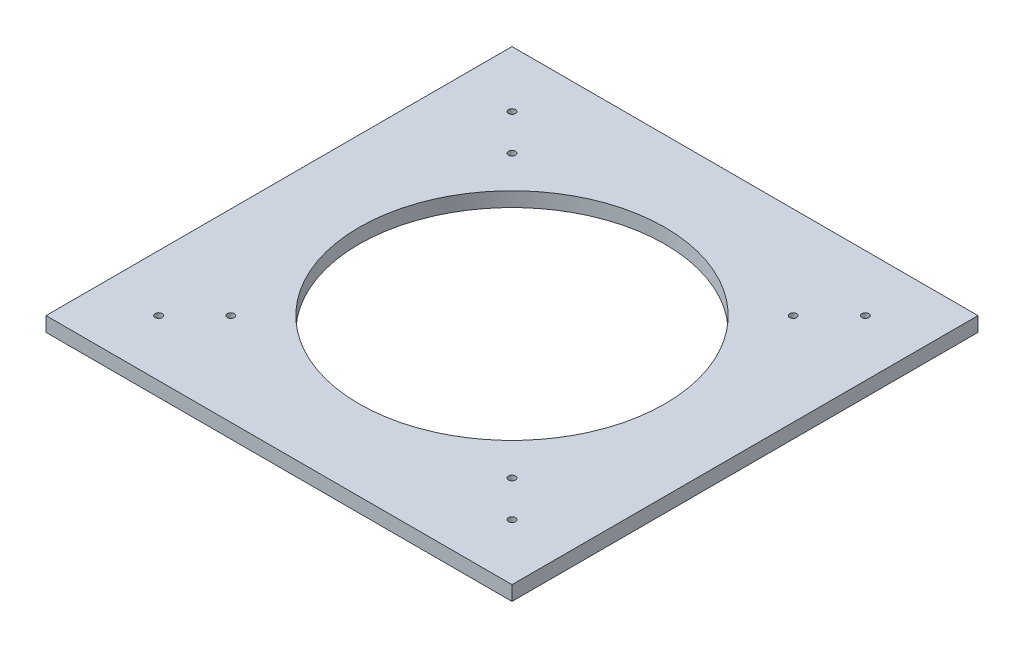
ISO-10303-21;
HEADER;
FILE_DESCRIPTION(('STEP AP214'),'2;1');
FILE_NAME('part.step','',(''),(''),'','','');
FILE_SCHEMA(('AUTOMOTIVE_DESIGN { 1 0 10303 214 1 1 1 1 }'));
ENDSEC;
DATA;
#1=APPLICATION_CONTEXT('core data for automotive mechanical design processes');
#2=APPLICATION_PROTOCOL_DEFINITION('international standard','automotive_design',2000,#1);
#3=PRODUCT_CONTEXT('',#1,'mechanical');
#4=PRODUCT('Part','Part','',(#3));
#5=PRODUCT_RELATED_PRODUCT_CATEGORY('part','',(#4));
#6=PRODUCT_DEFINITION_FORMATION('','',#4);
#7=PRODUCT_DEFINITION_CONTEXT('part definition',#1,'design');
#8=PRODUCT_DEFINITION('design','',#6,#7);
#9=PRODUCT_DEFINITION_SHAPE('','',#8);
#10=(LENGTH_UNIT() NAMED_UNIT(*) SI_UNIT(.MILLI.,.METRE.));
#11=(NAMED_UNIT(*) PLANE_ANGLE_UNIT() SI_UNIT($,.RADIAN.));
#12=(NAMED_UNIT(*) SI_UNIT($,.STERADIAN.) SOLID_ANGLE_UNIT());
#13=UNCERTAINTY_MEASURE_WITH_UNIT(LENGTH_MEASURE(1.E-05),#10,'distance_accuracy_value','');
#14=(GEOMETRIC_REPRESENTATION_CONTEXT(3) GLOBAL_UNCERTAINTY_ASSIGNED_CONTEXT((#13)) GLOBAL_UNIT_ASSIGNED_CONTEXT((#10,
#11,#12)) REPRESENTATION_CONTEXT('',''));
#15=CARTESIAN_POINT('',(0.,0.,0.));
#16=DIRECTION('',(0.,0.,1.));
#17=DIRECTION('',(1.,0.,0.));
#18=AXIS2_PLACEMENT_3D('',#15,#16,#17);
#19=CARTESIAN_POINT('',(0.,5.,0.));
#20=DIRECTION('',(0.,-1.,0.));
#21=DIRECTION('',(0.,0.,-1.));
#22=AXIS2_PLACEMENT_3D('',#19,#20,#21);
#23=PLANE('',#22);
#24=DIRECTION('',(0.,0.,-1.));
#25=VECTOR('',#24,1.);
#26=CARTESIAN_POINT('',(80.,5.,80.));
#27=LINE('',#26,#25);
#28=CARTESIAN_POINT('',(80.,5.,80.));
#29=VERTEX_POINT('',#28);
#30=CARTESIAN_POINT('',(80.,5.,-80.));
#31=VERTEX_POINT('',#30);
#32=EDGE_CURVE('E85',#29,#31,#27,.T.);
#33=ORIENTED_EDGE('',*,*,#32,.T.);
#34=DIRECTION('',(-1.,0.,0.));
#35=VECTOR('',#34,1.);
#36=CARTESIAN_POINT('',(-80.,5.,-80.));
#37=LINE('',#36,#35);
#38=CARTESIAN_POINT('',(-80.,5.,-80.));
#39=VERTEX_POINT('',#38);
#40=EDGE_CURVE('E80',#31,#39,#37,.T.);
#41=ORIENTED_EDGE('',*,*,#40,.T.);
#42=DIRECTION('',(0.,0.,1.));
#43=VECTOR('',#42,1.);
#44=CARTESIAN_POINT('',(-80.,5.,80.));
#45=LINE('',#44,#43);
#46=CARTESIAN_POINT('',(-80.,5.,80.));
#47=VERTEX_POINT('',#46);
#48=EDGE_CURVE('E83',#39,#47,#45,.T.);
#49=ORIENTED_EDGE('',*,*,#48,.T.);
#50=DIRECTION('',(1.,0.,0.));
#51=VECTOR('',#50,1.);
#52=CARTESIAN_POINT('',(-80.,5.,80.));
#53=LINE('',#52,#51);
#54=EDGE_CURVE('E50',#47,#29,#53,.T.);
#55=ORIENTED_EDGE('',*,*,#54,.T.);
#56=EDGE_LOOP('',(#33,#41,#49,#55));
#57=FACE_BOUND('',#56,.T.);
#58=CARTESIAN_POINT('',(-60.6642066420664,5.,-60.6642066420664));
#59=DIRECTION('',(0.,1.,0.));
#60=DIRECTION('',(0.,0.,1.));
#61=AXIS2_PLACEMENT_3D('',#58,#59,#60);
#62=CIRCLE('',#61,1.2);
#63=CARTESIAN_POINT('',(-60.6642066420664,5.,-59.4642066420664));
#64=VERTEX_POINT('',#63);
#65=EDGE_CURVE('E100',#64,#64,#62,.T.);
#66=ORIENTED_EDGE('',*,*,#65,.F.);
#67=EDGE_LOOP('',(#66));
#68=FACE_BOUND('',#67,.T.);
#69=CARTESIAN_POINT('',(-48.2795521345399,5.,-48.2795521345399));
#70=DIRECTION('',(0.,1.,0.));
#71=DIRECTION('',(0.,0.,1.));
#72=AXIS2_PLACEMENT_3D('',#69,#70,#71);
#73=CIRCLE('',#72,1.2);
#74=CARTESIAN_POINT('',(-48.2795521345399,5.,-47.0795521345399));
#75=VERTEX_POINT('',#74);
#76=EDGE_CURVE('E115',#75,#75,#73,.T.);
#77=ORIENTED_EDGE('',*,*,#76,.F.);
#78=EDGE_LOOP('',(#77));
#79=FACE_BOUND('',#78,.T.);
#80=CARTESIAN_POINT('',(48.2795521345399,5.,-48.2795521345399));
#81=DIRECTION('',(0.,1.,0.));
#82=DIRECTION('',(0.,0.,-1.));
#83=AXIS2_PLACEMENT_3D('',#80,#81,#82);
#84=CIRCLE('',#83,1.2);
#85=CARTESIAN_POINT('',(48.2795521345399,5.,-49.4795521345399));
#86=VERTEX_POINT('',#85);
#87=EDGE_CURVE('E121',#86,#86,#84,.T.);
#88=ORIENTED_EDGE('',*,*,#87,.F.);
#89=EDGE_LOOP('',(#88));
#90=FACE_BOUND('',#89,.T.);
#91=CARTESIAN_POINT('',(60.6642066420665,5.,-60.6642066420664));
#92=DIRECTION('',(0.,1.,0.));
#93=DIRECTION('',(0.,0.,-1.));
#94=AXIS2_PLACEMENT_3D('',#91,#92,#93);
#95=CIRCLE('',#94,1.2);
#96=CARTESIAN_POINT('',(60.6642066420665,5.,-61.8642066420664));
#97=VERTEX_POINT('',#96);
#98=EDGE_CURVE('E127',#97,#97,#95,.T.);
#99=ORIENTED_EDGE('',*,*,#98,.F.);
#100=EDGE_LOOP('',(#99));
#101=FACE_BOUND('',#100,.T.);
#102=CARTESIAN_POINT('',(60.6642066420665,5.,60.6642066420664));
#103=DIRECTION('',(0.,1.,0.));
#104=DIRECTION('',(0.,0.,1.));
#105=AXIS2_PLACEMENT_3D('',#102,#103,#104);
#106=CIRCLE('',#105,1.2);
#107=CARTESIAN_POINT('',(60.6642066420665,5.,61.8642066420664));
#108=VERTEX_POINT('',#107);
#109=EDGE_CURVE('E133',#108,#108,#106,.T.);
#110=ORIENTED_EDGE('',*,*,#109,.F.);
#111=EDGE_LOOP('',(#110));
#112=FACE_BOUND('',#111,.T.);
#113=CARTESIAN_POINT('',(48.2795521345399,5.,48.2795521345398));
#114=DIRECTION('',(0.,1.,0.));
#115=DIRECTION('',(0.,0.,1.));
#116=AXIS2_PLACEMENT_3D('',#113,#114,#115);
#117=CIRCLE('',#116,1.2);
#118=CARTESIAN_POINT('',(48.2795521345399,5.,49.4795521345398));
#119=VERTEX_POINT('',#118);
#120=EDGE_CURVE('E139',#119,#119,#117,.T.);
#121=ORIENTED_EDGE('',*,*,#120,.F.);
#122=EDGE_LOOP('',(#121));
#123=FACE_BOUND('',#122,.T.);
#124=CARTESIAN_POINT('',(-48.2795521345399,5.,48.2795521345399));
#125=DIRECTION('',(0.,1.,0.));
#126=DIRECTION('',(0.,0.,-1.));
#127=AXIS2_PLACEMENT_3D('',#124,#125,#126);
#128=CIRCLE('',#127,1.2);
#129=CARTESIAN_POINT('',(-48.2795521345399,5.,47.0795521345399));
#130=VERTEX_POINT('',#129);
#131=EDGE_CURVE('E145',#130,#130,#128,.T.);
#132=ORIENTED_EDGE('',*,*,#131,.F.);
#133=EDGE_LOOP('',(#132));
#134=FACE_BOUND('',#133,.T.);
#135=CARTESIAN_POINT('',(-60.6642066420664,5.,60.6642066420664));
#136=DIRECTION('',(0.,1.,0.));
#137=DIRECTION('',(0.,0.,-1.));
#138=AXIS2_PLACEMENT_3D('',#135,#136,#137);
#139=CIRCLE('',#138,1.2);
#140=CARTESIAN_POINT('',(-60.6642066420664,5.,59.4642066420664));
#141=VERTEX_POINT('',#140);
#142=EDGE_CURVE('E151',#141,#141,#139,.T.);
#143=ORIENTED_EDGE('',*,*,#142,.F.);
#144=EDGE_LOOP('',(#143));
#145=FACE_BOUND('',#144,.T.);
#146=CARTESIAN_POINT('',(0.,5.,0.));
#147=DIRECTION('',(0.,1.,0.));
#148=DIRECTION('',(0.,0.,1.));
#149=AXIS2_PLACEMENT_3D('',#146,#147,#148);
#150=CIRCLE('',#149,52.5);
#151=CARTESIAN_POINT('',(0.,5.,52.5));
#152=VERTEX_POINT('',#151);
#153=EDGE_CURVE('E157',#152,#152,#150,.T.);
#154=ORIENTED_EDGE('',*,*,#153,.F.);
#155=EDGE_LOOP('',(#154));
#156=FACE_BOUND('',#155,.T.);
#157=ADVANCED_FACE('F33',(#57,#68,#79,#90,#101,#112,#123,#134,#145,#156),#23,.F.);
#158=CARTESIAN_POINT('',(0.,0.,0.));
#159=DIRECTION('',(0.,-1.,0.));
#160=DIRECTION('',(0.,0.,-1.));
#161=AXIS2_PLACEMENT_3D('',#158,#159,#160);
#162=PLANE('',#161);
#163=CARTESIAN_POINT('',(-60.6642066420664,0.,60.6642066420664));
#164=DIRECTION('',(0.,1.,0.));
#165=DIRECTION('',(0.,0.,-1.));
#166=AXIS2_PLACEMENT_3D('',#163,#164,#165);
#167=CIRCLE('',#166,1.2);
#168=CARTESIAN_POINT('',(-60.6642066420664,0.,59.4642066420664));
#169=VERTEX_POINT('',#168);
#170=EDGE_CURVE('E154',#169,#169,#167,.T.);
#171=ORIENTED_EDGE('',*,*,#170,.T.);
#172=EDGE_LOOP('',(#171));
#173=FACE_BOUND('',#172,.T.);
#174=CARTESIAN_POINT('',(48.2795521345399,0.,48.2795521345398));
#175=DIRECTION('',(0.,1.,0.));
#176=DIRECTION('',(0.,0.,1.));
#177=AXIS2_PLACEMENT_3D('',#174,#175,#176);
#178=CIRCLE('',#177,1.2);
#179=CARTESIAN_POINT('',(48.2795521345399,0.,49.4795521345398));
#180=VERTEX_POINT('',#179);
#181=EDGE_CURVE('E142',#180,#180,#178,.T.);
#182=ORIENTED_EDGE('',*,*,#181,.T.);
#183=EDGE_LOOP('',(#182));
#184=FACE_BOUND('',#183,.T.);
#185=CARTESIAN_POINT('',(60.6642066420665,0.,-60.6642066420664));
#186=DIRECTION('',(0.,1.,0.));
#187=DIRECTION('',(0.,0.,-1.));
#188=AXIS2_PLACEMENT_3D('',#185,#186,#187);
#189=CIRCLE('',#188,1.2);
#190=CARTESIAN_POINT('',(60.6642066420665,0.,-61.8642066420664));
#191=VERTEX_POINT('',#190);
#192=EDGE_CURVE('E130',#191,#191,#189,.T.);
#193=ORIENTED_EDGE('',*,*,#192,.T.);
#194=EDGE_LOOP('',(#193));
#195=FACE_BOUND('',#194,.T.);
#196=CARTESIAN_POINT('',(-48.2795521345399,0.,-48.2795521345399));
#197=DIRECTION('',(0.,1.,0.));
#198=DIRECTION('',(0.,0.,1.));
#199=AXIS2_PLACEMENT_3D('',#196,#197,#198);
#200=CIRCLE('',#199,1.2);
#201=CARTESIAN_POINT('',(-48.2795521345399,0.,-47.0795521345399));
#202=VERTEX_POINT('',#201);
#203=EDGE_CURVE('E118',#202,#202,#200,.T.);
#204=ORIENTED_EDGE('',*,*,#203,.T.);
#205=EDGE_LOOP('',(#204));
#206=FACE_BOUND('',#205,.T.);
#207=DIRECTION('',(0.,0.,-1.));
#208=VECTOR('',#207,1.);
#209=CARTESIAN_POINT('',(80.,0.,80.));
#210=LINE('',#209,#208);
#211=CARTESIAN_POINT('',(80.,0.,80.));
#212=VERTEX_POINT('',#211);
#213=CARTESIAN_POINT('',(80.,0.,-80.));
#214=VERTEX_POINT('',#213);
#215=EDGE_CURVE('E97',#212,#214,#210,.T.);
#216=ORIENTED_EDGE('',*,*,#215,.F.);
#217=DIRECTION('',(1.,0.,0.));
#218=VECTOR('',#217,1.);
#219=CARTESIAN_POINT('',(-80.,0.,80.));
#220=LINE('',#219,#218);
#221=CARTESIAN_POINT('',(-80.,0.,80.));
#222=VERTEX_POINT('',#221);
#223=EDGE_CURVE('E73',#222,#212,#220,.T.);
#224=ORIENTED_EDGE('',*,*,#223,.F.);
#225=DIRECTION('',(0.,0.,1.));
#226=VECTOR('',#225,1.);
#227=CARTESIAN_POINT('',(-80.,0.,80.));
#228=LINE('',#227,#226);
#229=CARTESIAN_POINT('',(-80.,0.,-80.));
#230=VERTEX_POINT('',#229);
#231=EDGE_CURVE('E67',#230,#222,#228,.T.);
#232=ORIENTED_EDGE('',*,*,#231,.F.);
#233=DIRECTION('',(-1.,0.,0.));
#234=VECTOR('',#233,1.);
#235=CARTESIAN_POINT('',(-80.,0.,-80.));
#236=LINE('',#235,#234);
#237=EDGE_CURVE('E89',#214,#230,#236,.T.);
#238=ORIENTED_EDGE('',*,*,#237,.F.);
#239=EDGE_LOOP('',(#216,#224,#232,#238));
#240=FACE_BOUND('',#239,.T.);
#241=CARTESIAN_POINT('',(-60.6642066420664,0.,-60.6642066420664));
#242=DIRECTION('',(0.,1.,0.));
#243=DIRECTION('',(0.,0.,1.));
#244=AXIS2_PLACEMENT_3D('',#241,#242,#243);
#245=CIRCLE('',#244,1.2);
#246=CARTESIAN_POINT('',(-60.6642066420664,0.,-59.4642066420664));
#247=VERTEX_POINT('',#246);
#248=EDGE_CURVE('E112',#247,#247,#245,.T.);
#249=ORIENTED_EDGE('',*,*,#248,.T.);
#250=EDGE_LOOP('',(#249));
#251=FACE_BOUND('',#250,.T.);
#252=CARTESIAN_POINT('',(48.2795521345399,0.,-48.2795521345399));
#253=DIRECTION('',(0.,1.,0.));
#254=DIRECTION('',(0.,0.,-1.));
#255=AXIS2_PLACEMENT_3D('',#252,#253,#254);
#256=CIRCLE('',#255,1.2);
#257=CARTESIAN_POINT('',(48.2795521345399,0.,-49.4795521345399));
#258=VERTEX_POINT('',#257);
#259=EDGE_CURVE('E124',#258,#258,#256,.T.);
#260=ORIENTED_EDGE('',*,*,#259,.T.);
#261=EDGE_LOOP('',(#260));
#262=FACE_BOUND('',#261,.T.);
#263=CARTESIAN_POINT('',(60.6642066420665,0.,60.6642066420664));
#264=DIRECTION('',(0.,1.,0.));
#265=DIRECTION('',(0.,0.,1.));
#266=AXIS2_PLACEMENT_3D('',#263,#264,#265);
#267=CIRCLE('',#266,1.2);
#268=CARTESIAN_POINT('',(60.6642066420665,0.,61.8642066420664));
#269=VERTEX_POINT('',#268);
#270=EDGE_CURVE('E136',#269,#269,#267,.T.);
#271=ORIENTED_EDGE('',*,*,#270,.T.);
#272=EDGE_LOOP('',(#271));
#273=FACE_BOUND('',#272,.T.);
#274=CARTESIAN_POINT('',(-48.2795521345399,0.,48.2795521345399));
#275=DIRECTION('',(0.,1.,0.));
#276=DIRECTION('',(0.,0.,-1.));
#277=AXIS2_PLACEMENT_3D('',#274,#275,#276);
#278=CIRCLE('',#277,1.2);
#279=CARTESIAN_POINT('',(-48.2795521345399,0.,47.0795521345399));
#280=VERTEX_POINT('',#279);
#281=EDGE_CURVE('E148',#280,#280,#278,.T.);
#282=ORIENTED_EDGE('',*,*,#281,.T.);
#283=EDGE_LOOP('',(#282));
#284=FACE_BOUND('',#283,.T.);
#285=CARTESIAN_POINT('',(0.,0.,0.));
#286=DIRECTION('',(0.,1.,0.));
#287=DIRECTION('',(0.,0.,1.));
#288=AXIS2_PLACEMENT_3D('',#285,#286,#287);
#289=CIRCLE('',#288,52.5);
#290=CARTESIAN_POINT('',(0.,0.,52.5));
#291=VERTEX_POINT('',#290);
#292=EDGE_CURVE('E160',#291,#291,#289,.T.);
#293=ORIENTED_EDGE('',*,*,#292,.T.);
#294=EDGE_LOOP('',(#293));
#295=FACE_BOUND('',#294,.T.);
#296=ADVANCED_FACE('F108',(#173,#184,#195,#206,#240,#251,#262,#273,#284,#295),#162,.T.);
#297=CARTESIAN_POINT('',(80.,5.,80.));
#298=DIRECTION('',(-1.,0.,0.));
#299=DIRECTION('',(0.,0.,1.));
#300=AXIS2_PLACEMENT_3D('',#297,#298,#299);
#301=PLANE('',#300);
#302=ORIENTED_EDGE('',*,*,#215,.T.);
#303=DIRECTION('',(0.,-1.,0.));
#304=VECTOR('',#303,1.);
#305=CARTESIAN_POINT('',(80.,5.,-80.));
#306=LINE('',#305,#304);
#307=EDGE_CURVE('E11',#31,#214,#306,.T.);
#308=ORIENTED_EDGE('',*,*,#307,.F.);
#309=ORIENTED_EDGE('',*,*,#32,.F.);
#310=DIRECTION('',(0.,-1.,0.));
#311=VECTOR('',#310,1.);
#312=CARTESIAN_POINT('',(80.,5.,80.));
#313=LINE('',#312,#311);
#314=EDGE_CURVE('E93',#29,#212,#313,.T.);
#315=ORIENTED_EDGE('',*,*,#314,.T.);
#316=EDGE_LOOP('',(#302,#308,#309,#315));
#317=FACE_BOUND('',#316,.T.);
#318=ADVANCED_FACE('F35',(#317),#301,.F.);
#319=CARTESIAN_POINT('',(-80.,5.,-80.));
#320=DIRECTION('',(0.,0.,1.));
#321=DIRECTION('',(1.,0.,0.));
#322=AXIS2_PLACEMENT_3D('',#319,#320,#321);
#323=PLANE('',#322);
#324=ORIENTED_EDGE('',*,*,#237,.T.);
#325=DIRECTION('',(0.,-1.,0.));
#326=VECTOR('',#325,1.);
#327=CARTESIAN_POINT('',(-80.,5.,-80.));
#328=LINE('',#327,#326);
#329=EDGE_CURVE('E42',#39,#230,#328,.T.);
#330=ORIENTED_EDGE('',*,*,#329,.F.);
#331=ORIENTED_EDGE('',*,*,#40,.F.);
#332=ORIENTED_EDGE('',*,*,#307,.T.);
#333=EDGE_LOOP('',(#324,#330,#331,#332));
#334=FACE_BOUND('',#333,.T.);
#335=ADVANCED_FACE('F88',(#334),#323,.F.);
#336=CARTESIAN_POINT('',(-80.,5.,80.));
#337=DIRECTION('',(1.,0.,0.));
#338=DIRECTION('',(0.,0.,-1.));
#339=AXIS2_PLACEMENT_3D('',#336,#337,#338);
#340=PLANE('',#339);
#341=ORIENTED_EDGE('',*,*,#231,.T.);
#342=DIRECTION('',(0.,-1.,0.));
#343=VECTOR('',#342,1.);
#344=CARTESIAN_POINT('',(-80.,5.,80.));
#345=LINE('',#344,#343);
#346=EDGE_CURVE('E90',#47,#222,#345,.T.);
#347=ORIENTED_EDGE('',*,*,#346,.F.);
#348=ORIENTED_EDGE('',*,*,#48,.F.);
#349=ORIENTED_EDGE('',*,*,#329,.T.);
#350=EDGE_LOOP('',(#341,#347,#348,#349));
#351=FACE_BOUND('',#350,.T.);
#352=ADVANCED_FACE('F91',(#351),#340,.F.);
#353=CARTESIAN_POINT('',(-80.,5.,80.));
#354=DIRECTION('',(0.,0.,-1.));
#355=DIRECTION('',(-1.,0.,0.));
#356=AXIS2_PLACEMENT_3D('',#353,#354,#355);
#357=PLANE('',#356);
#358=ORIENTED_EDGE('',*,*,#223,.T.);
#359=ORIENTED_EDGE('',*,*,#314,.F.);
#360=ORIENTED_EDGE('',*,*,#54,.F.);
#361=ORIENTED_EDGE('',*,*,#346,.T.);
#362=EDGE_LOOP('',(#358,#359,#360,#361));
#363=FACE_BOUND('',#362,.T.);
#364=ADVANCED_FACE('F105',(#363),#357,.F.);
#365=CARTESIAN_POINT('',(-60.6642066420664,5.,-60.6642066420664));
#366=DIRECTION('',(0.,-1.,0.));
#367=DIRECTION('',(0.,0.,-1.));
#368=AXIS2_PLACEMENT_3D('',#365,#366,#367);
#369=CYLINDRICAL_SURFACE('',#368,1.2);
#370=ORIENTED_EDGE('',*,*,#65,.T.);
#371=EDGE_LOOP('',(#370));
#372=FACE_BOUND('',#371,.T.);
#373=ORIENTED_EDGE('',*,*,#248,.F.);
#374=EDGE_LOOP('',(#373));
#375=FACE_BOUND('',#374,.T.);
#376=ADVANCED_FACE('F177',(#372,#375),#369,.F.);
#377=CARTESIAN_POINT('',(-48.2795521345399,5.,-48.2795521345399));
#378=DIRECTION('',(0.,-1.,0.));
#379=DIRECTION('',(0.,0.,-1.));
#380=AXIS2_PLACEMENT_3D('',#377,#378,#379);
#381=CYLINDRICAL_SURFACE('',#380,1.2);
#382=ORIENTED_EDGE('',*,*,#76,.T.);
#383=EDGE_LOOP('',(#382));
#384=FACE_BOUND('',#383,.T.);
#385=ORIENTED_EDGE('',*,*,#203,.F.);
#386=EDGE_LOOP('',(#385));
#387=FACE_BOUND('',#386,.T.);
#388=ADVANCED_FACE('F223',(#384,#387),#381,.F.);
#389=CARTESIAN_POINT('',(48.2795521345399,5.,-48.2795521345399));
#390=DIRECTION('',(0.,-1.,0.));
#391=DIRECTION('',(0.,0.,-1.));
#392=AXIS2_PLACEMENT_3D('',#389,#390,#391);
#393=CYLINDRICAL_SURFACE('',#392,1.2);
#394=ORIENTED_EDGE('',*,*,#87,.T.);
#395=EDGE_LOOP('',(#394));
#396=FACE_BOUND('',#395,.T.);
#397=ORIENTED_EDGE('',*,*,#259,.F.);
#398=EDGE_LOOP('',(#397));
#399=FACE_BOUND('',#398,.T.);
#400=ADVANCED_FACE('F231',(#396,#399),#393,.F.);
#401=CARTESIAN_POINT('',(60.6642066420665,5.,-60.6642066420664));
#402=DIRECTION('',(0.,-1.,0.));
#403=DIRECTION('',(0.,0.,-1.));
#404=AXIS2_PLACEMENT_3D('',#401,#402,#403);
#405=CYLINDRICAL_SURFACE('',#404,1.2);
#406=ORIENTED_EDGE('',*,*,#98,.T.);
#407=EDGE_LOOP('',(#406));
#408=FACE_BOUND('',#407,.T.);
#409=ORIENTED_EDGE('',*,*,#192,.F.);
#410=EDGE_LOOP('',(#409));
#411=FACE_BOUND('',#410,.T.);
#412=ADVANCED_FACE('F239',(#408,#411),#405,.F.);
#413=CARTESIAN_POINT('',(60.6642066420665,5.,60.6642066420664));
#414=DIRECTION('',(0.,-1.,0.));
#415=DIRECTION('',(0.,0.,-1.));
#416=AXIS2_PLACEMENT_3D('',#413,#414,#415);
#417=CYLINDRICAL_SURFACE('',#416,1.2);
#418=ORIENTED_EDGE('',*,*,#109,.T.);
#419=EDGE_LOOP('',(#418));
#420=FACE_BOUND('',#419,.T.);
#421=ORIENTED_EDGE('',*,*,#270,.F.);
#422=EDGE_LOOP('',(#421));
#423=FACE_BOUND('',#422,.T.);
#424=ADVANCED_FACE('F248',(#420,#423),#417,.F.);
#425=CARTESIAN_POINT('',(48.2795521345399,5.,48.2795521345398));
#426=DIRECTION('',(0.,-1.,0.));
#427=DIRECTION('',(0.,0.,-1.));
#428=AXIS2_PLACEMENT_3D('',#425,#426,#427);
#429=CYLINDRICAL_SURFACE('',#428,1.2);
#430=ORIENTED_EDGE('',*,*,#120,.T.);
#431=EDGE_LOOP('',(#430));
#432=FACE_BOUND('',#431,.T.);
#433=ORIENTED_EDGE('',*,*,#181,.F.);
#434=EDGE_LOOP('',(#433));
#435=FACE_BOUND('',#434,.T.);
#436=ADVANCED_FACE('F257',(#432,#435),#429,.F.);
#437=CARTESIAN_POINT('',(-48.2795521345399,5.,48.2795521345399));
#438=DIRECTION('',(0.,-1.,0.));
#439=DIRECTION('',(0.,0.,-1.));
#440=AXIS2_PLACEMENT_3D('',#437,#438,#439);
#441=CYLINDRICAL_SURFACE('',#440,1.2);
#442=ORIENTED_EDGE('',*,*,#131,.T.);
#443=EDGE_LOOP('',(#442));
#444=FACE_BOUND('',#443,.T.);
#445=ORIENTED_EDGE('',*,*,#281,.F.);
#446=EDGE_LOOP('',(#445));
#447=FACE_BOUND('',#446,.T.);
#448=ADVANCED_FACE('F266',(#444,#447),#441,.F.);
#449=CARTESIAN_POINT('',(-60.6642066420664,5.,60.6642066420664));
#450=DIRECTION('',(0.,-1.,0.));
#451=DIRECTION('',(0.,0.,-1.));
#452=AXIS2_PLACEMENT_3D('',#449,#450,#451);
#453=CYLINDRICAL_SURFACE('',#452,1.2);
#454=ORIENTED_EDGE('',*,*,#142,.T.);
#455=EDGE_LOOP('',(#454));
#456=FACE_BOUND('',#455,.T.);
#457=ORIENTED_EDGE('',*,*,#170,.F.);
#458=EDGE_LOOP('',(#457));
#459=FACE_BOUND('',#458,.T.);
#460=ADVANCED_FACE('F275',(#456,#459),#453,.F.);
#461=CARTESIAN_POINT('',(0.,5.,0.));
#462=DIRECTION('',(0.,-1.,0.));
#463=DIRECTION('',(0.,0.,-1.));
#464=AXIS2_PLACEMENT_3D('',#461,#462,#463);
#465=CYLINDRICAL_SURFACE('',#464,52.5);
#466=ORIENTED_EDGE('',*,*,#153,.T.);
#467=EDGE_LOOP('',(#466));
#468=FACE_BOUND('',#467,.T.);
#469=ORIENTED_EDGE('',*,*,#292,.F.);
#470=EDGE_LOOP('',(#469));
#471=FACE_BOUND('',#470,.T.);
#472=ADVANCED_FACE('F166',(#468,#471),#465,.F.);
#473=CLOSED_SHELL('',(#157,#296,#318,#335,#352,#364,#376,#388,#400,#412,#424,#436,#448,#460,#472));
#474=MANIFOLD_SOLID_BREP('B2',#473);
#475=ADVANCED_BREP_SHAPE_REPRESENTATION('',(#18,#474),#14);
#476=SHAPE_DEFINITION_REPRESENTATION(#9,#475);
ENDSEC;
END-ISO-10303-21;
